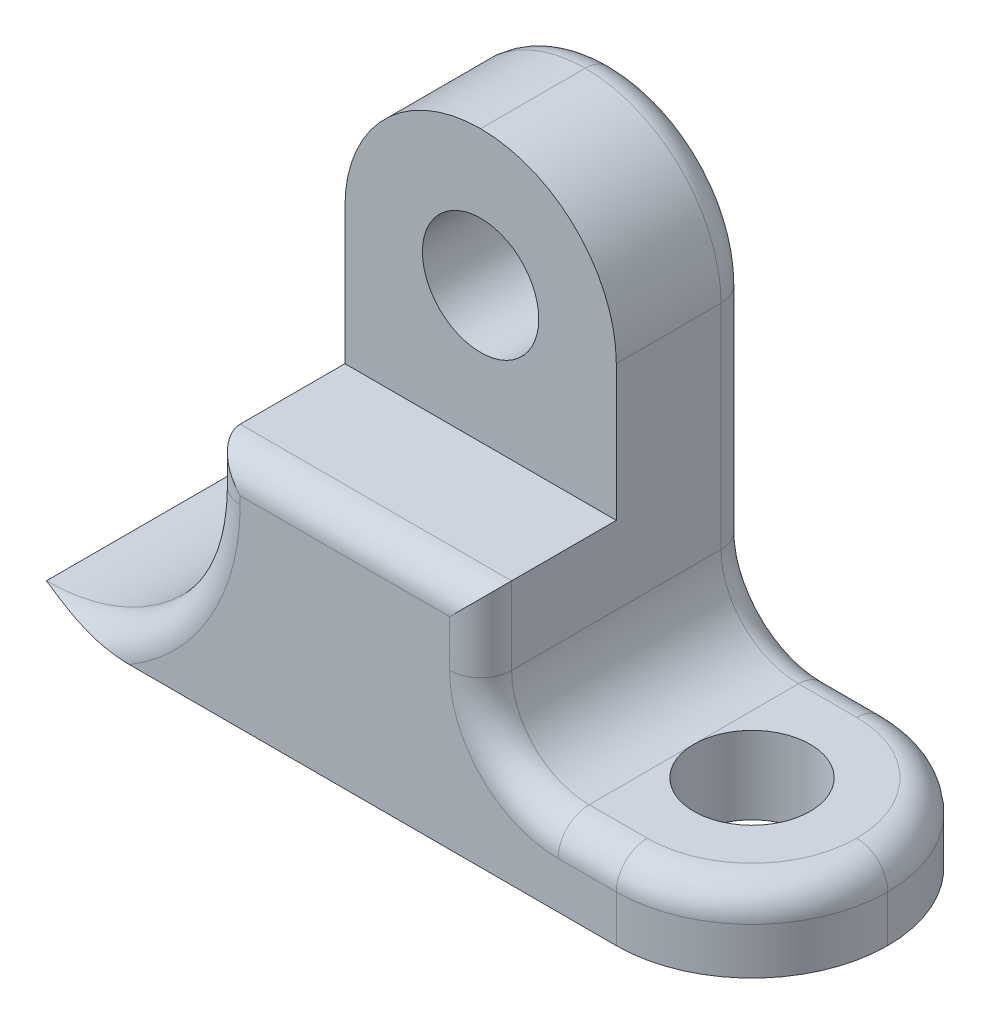
ISO-10303-21;
HEADER;
FILE_DESCRIPTION(('STEP AP214'),'2;1');
FILE_NAME('part.step','',(''),(''),'','','');
FILE_SCHEMA(('AUTOMOTIVE_DESIGN { 1 0 10303 214 1 1 1 1 }'));
ENDSEC;
DATA;
#1=APPLICATION_CONTEXT('core data for automotive mechanical design processes');
#2=APPLICATION_PROTOCOL_DEFINITION('international standard','automotive_design',2000,#1);
#3=PRODUCT_CONTEXT('',#1,'mechanical');
#4=PRODUCT('Part','Part','',(#3));
#5=PRODUCT_RELATED_PRODUCT_CATEGORY('part','',(#4));
#6=PRODUCT_DEFINITION_FORMATION('','',#4);
#7=PRODUCT_DEFINITION_CONTEXT('part definition',#1,'design');
#8=PRODUCT_DEFINITION('design','',#6,#7);
#9=PRODUCT_DEFINITION_SHAPE('','',#8);
#10=(LENGTH_UNIT() NAMED_UNIT(*) SI_UNIT(.MILLI.,.METRE.));
#11=(NAMED_UNIT(*) PLANE_ANGLE_UNIT() SI_UNIT($,.RADIAN.));
#12=(NAMED_UNIT(*) SI_UNIT($,.STERADIAN.) SOLID_ANGLE_UNIT());
#13=UNCERTAINTY_MEASURE_WITH_UNIT(LENGTH_MEASURE(1.E-05),#10,'distance_accuracy_value','');
#14=(GEOMETRIC_REPRESENTATION_CONTEXT(3) GLOBAL_UNCERTAINTY_ASSIGNED_CONTEXT((#13)) GLOBAL_UNIT_ASSIGNED_CONTEXT((#10,
#11,#12)) REPRESENTATION_CONTEXT('',''));
#15=CARTESIAN_POINT('',(0.,0.,0.));
#16=DIRECTION('',(0.,0.,1.));
#17=DIRECTION('',(1.,0.,0.));
#18=AXIS2_PLACEMENT_3D('',#15,#16,#17);
#19=CARTESIAN_POINT('',(-8.5,-1.5,7.));
#20=DIRECTION('',(0.,0.,-1.));
#21=DIRECTION('',(-1.,0.,0.));
#22=AXIS2_PLACEMENT_3D('',#19,#20,#21);
#23=CYLINDRICAL_SURFACE('',#22,5.);
#24=DIRECTION('',(0.,0.,-1.));
#25=VECTOR('',#24,1.);
#26=CARTESIAN_POINT('',(-3.5,-1.5,7.));
#27=LINE('',#26,#25);
#28=CARTESIAN_POINT('',(-3.5,-1.5,6.2));
#29=VERTEX_POINT('',#28);
#30=CARTESIAN_POINT('',(-3.5,-1.5,0.8));
#31=VERTEX_POINT('',#30);
#32=EDGE_CURVE('E218',#29,#31,#27,.T.);
#33=ORIENTED_EDGE('',*,*,#32,.T.);
#34=CARTESIAN_POINT('',(-8.5,-1.5,0.8));
#35=DIRECTION('',(0.,0.,1.));
#36=DIRECTION('',(1.,0.,0.));
#37=AXIS2_PLACEMENT_3D('',#34,#35,#36);
#38=CIRCLE('',#37,5.);
#39=CARTESIAN_POINT('',(-8.5,-6.5,0.8));
#40=VERTEX_POINT('',#39);
#41=EDGE_CURVE('E286',#31,#40,#38,.F.);
#42=ORIENTED_EDGE('',*,*,#41,.T.);
#43=DIRECTION('',(0.,0.,-1.));
#44=VECTOR('',#43,1.);
#45=CARTESIAN_POINT('',(-8.5,-6.5,7.));
#46=LINE('',#45,#44);
#47=CARTESIAN_POINT('',(-8.5,-6.5,6.2));
#48=VERTEX_POINT('',#47);
#49=EDGE_CURVE('E223',#48,#40,#46,.T.);
#50=ORIENTED_EDGE('',*,*,#49,.F.);
#51=CARTESIAN_POINT('',(-8.5,-1.5,6.2));
#52=DIRECTION('',(0.,0.,1.));
#53=DIRECTION('',(1.,0.,0.));
#54=AXIS2_PLACEMENT_3D('',#51,#52,#53);
#55=CIRCLE('',#54,5.);
#56=EDGE_CURVE('E284',#48,#29,#55,.T.);
#57=ORIENTED_EDGE('',*,*,#56,.T.);
#58=EDGE_LOOP('',(#33,#42,#50,#57));
#59=FACE_BOUND('',#58,.T.);
#60=ADVANCED_FACE('F39',(#59),#23,.F.);
#61=CARTESIAN_POINT('',(0.,-6.5,7.));
#62=DIRECTION('',(0.,-1.,0.));
#63=DIRECTION('',(0.,0.,-1.));
#64=AXIS2_PLACEMENT_3D('',#61,#62,#63);
#65=PLANE('',#64);
#66=CARTESIAN_POINT('',(7.,-6.5,3.5));
#67=DIRECTION('',(0.,1.,0.));
#68=DIRECTION('',(-1.,0.,0.));
#69=AXIS2_PLACEMENT_3D('',#66,#67,#68);
#70=CIRCLE('',#69,1.5);
#71=CARTESIAN_POINT('',(5.5,-6.5,3.5));
#72=VERTEX_POINT('',#71);
#73=EDGE_CURVE('E455',#72,#72,#70,.T.);
#74=ORIENTED_EDGE('',*,*,#73,.T.);
#75=EDGE_LOOP('',(#74));
#76=FACE_BOUND('',#75,.T.);
#77=ORIENTED_EDGE('',*,*,#49,.T.);
#78=CARTESIAN_POINT('',(-5.56061230866019,-6.5,0.));
#79=CARTESIAN_POINT('',(-5.61843790454167,-6.5,8.93337683398929E-06));
#80=CARTESIAN_POINT('',(-5.67623988707474,-6.5,0.00160899487362097));
#81=CARTESIAN_POINT('',(-5.79166453259725,-6.5,0.00763971675142861));
#82=CARTESIAN_POINT('',(-5.84928728143457,-6.5,0.0120687021797724));
#83=CARTESIAN_POINT('',(-6.02146755610683,-6.5,0.029043405144011));
#84=CARTESIAN_POINT('',(-6.13566365845437,-6.5,0.0452809031727915));
#85=CARTESIAN_POINT('',(-6.36158412393588,-6.5,0.0852657219761762));
#86=CARTESIAN_POINT('',(-6.47332157283069,-6.5,0.10894233721513));
#87=CARTESIAN_POINT('',(-6.69544269756369,-6.5,0.162238621695083));
#88=CARTESIAN_POINT('',(-6.80582522767447,-6.5,0.191862996291862));
#89=CARTESIAN_POINT('',(-7.04921198528406,-6.5,0.262671761824172));
#90=CARTESIAN_POINT('',(-7.18188879112123,-6.5,0.304967662972999));
#91=CARTESIAN_POINT('',(-7.44562616701472,-6.5,0.394360475600995));
#92=CARTESIAN_POINT('',(-7.576686312957,-6.5,0.441458618084553));
#93=CARTESIAN_POINT('',(-7.9686406836952,-6.5,0.587531009615996));
#94=CARTESIAN_POINT('',(-8.22778903759083,-6.5,0.691116851145545));
#95=CARTESIAN_POINT('',(-8.4912462460567,-6.5,0.796498510921233));
#96=CARTESIAN_POINT('',(-8.4956231272981,-6.5,0.798249263723546));
#97=CARTESIAN_POINT('',(-8.5,-6.5,0.8));
#98=B_SPLINE_CURVE_WITH_KNOTS('',3,(#78,#79,#80,#81,#82,#83,#84,#85,#86,#87,#88,#89,#90,#91,#92,
#93,#94,#95,#96,#97),.UNSPECIFIED.,.F.,.F.,(4,2,2,2,2,2,2,2,2,4),(0.,0.173418666547662,
0.346734750222216,0.692390891158026,1.03485633591092,1.37759378506866,1.79522407896125,
2.21296169845093,3.05007204962128,3.06421418524502),.UNSPECIFIED.);
#99=CARTESIAN_POINT('',(-5.56061230866019,-6.5,0.));
#100=VERTEX_POINT('',#99);
#101=EDGE_CURVE('E295',#40,#100,#98,.F.);
#102=ORIENTED_EDGE('',*,*,#101,.T.);
#103=DIRECTION('',(-1.,0.,0.));
#104=VECTOR('',#103,1.);
#105=CARTESIAN_POINT('',(0.,-6.5,0.));
#106=LINE('',#105,#104);
#107=CARTESIAN_POINT('',(7.,-6.5,0.));
#108=VERTEX_POINT('',#107);
#109=EDGE_CURVE('E211',#108,#100,#106,.T.);
#110=ORIENTED_EDGE('',*,*,#109,.F.);
#111=CARTESIAN_POINT('',(7.,-6.5,3.5));
#112=DIRECTION('',(0.,-1.,0.));
#113=DIRECTION('',(0.,0.,-1.));
#114=AXIS2_PLACEMENT_3D('',#111,#112,#113);
#115=CIRCLE('',#114,3.5);
#116=CARTESIAN_POINT('',(10.5,-6.5,3.5));
#117=VERTEX_POINT('',#116);
#118=EDGE_CURVE('E230',#108,#117,#115,.T.);
#119=ORIENTED_EDGE('',*,*,#118,.T.);
#120=CARTESIAN_POINT('',(7.,-6.5,3.5));
#121=DIRECTION('',(0.,-1.,0.));
#122=DIRECTION('',(0.,0.,-1.));
#123=AXIS2_PLACEMENT_3D('',#120,#121,#122);
#124=CIRCLE('',#123,3.5);
#125=CARTESIAN_POINT('',(7.,-6.5,7.));
#126=VERTEX_POINT('',#125);
#127=EDGE_CURVE('E228',#117,#126,#124,.T.);
#128=ORIENTED_EDGE('',*,*,#127,.T.);
#129=DIRECTION('',(-1.,0.,0.));
#130=VECTOR('',#129,1.);
#131=CARTESIAN_POINT('',(0.,-6.5,7.));
#132=LINE('',#131,#130);
#133=CARTESIAN_POINT('',(-5.56061230866019,-6.5,7.));
#134=VERTEX_POINT('',#133);
#135=EDGE_CURVE('E215',#126,#134,#132,.T.);
#136=ORIENTED_EDGE('',*,*,#135,.T.);
#137=CARTESIAN_POINT('',(-5.56061230866019,-6.5,7.));
#138=CARTESIAN_POINT('',(-5.61843790454167,-6.5,6.99999106662317));
#139=CARTESIAN_POINT('',(-5.67623988707474,-6.5,6.99839100512638));
#140=CARTESIAN_POINT('',(-5.79166453259725,-6.5,6.99236028324857));
#141=CARTESIAN_POINT('',(-5.84928728143457,-6.5,6.98793129782023));
#142=CARTESIAN_POINT('',(-6.02146755610683,-6.5,6.97095659485599));
#143=CARTESIAN_POINT('',(-6.13566365845437,-6.5,6.95471909682721));
#144=CARTESIAN_POINT('',(-6.36158412393588,-6.5,6.91473427802382));
#145=CARTESIAN_POINT('',(-6.47332157283069,-6.5,6.89105766278487));
#146=CARTESIAN_POINT('',(-6.69544269756369,-6.5,6.83776137830492));
#147=CARTESIAN_POINT('',(-6.80582522767447,-6.5,6.80813700370814));
#148=CARTESIAN_POINT('',(-7.04921198528406,-6.5,6.73732823817583));
#149=CARTESIAN_POINT('',(-7.18188879112123,-6.5,6.695032337027));
#150=CARTESIAN_POINT('',(-7.44562616701472,-6.5,6.605639524399));
#151=CARTESIAN_POINT('',(-7.576686312957,-6.5,6.55854138191545));
#152=CARTESIAN_POINT('',(-7.96864068369521,-6.5,6.41246899038401));
#153=CARTESIAN_POINT('',(-8.22778903759084,-6.5,6.30888314885447));
#154=CARTESIAN_POINT('',(-8.4912462460567,-6.5,6.20350148907877));
#155=CARTESIAN_POINT('',(-8.4956231272981,-6.5,6.20175073627645));
#156=CARTESIAN_POINT('',(-8.5,-6.5,6.2));
#157=B_SPLINE_CURVE_WITH_KNOTS('',3,(#137,#138,#139,#140,#141,#142,#143,#144,#145,#146,#147,
#148,#149,#150,#151,#152,#153,#154,#155,#156),.UNSPECIFIED.,.F.,.F.,(4,2,2,2,2,2,2,2,2,4),(0.,
0.173418666547661,0.346734750222216,0.692390891158025,1.03485633591092,1.37759378506866,
1.79522407896125,2.21296169845093,3.05007204962128,3.06421418524502),.UNSPECIFIED.);
#158=EDGE_CURVE('E288',#134,#48,#157,.T.);
#159=ORIENTED_EDGE('',*,*,#158,.T.);
#160=EDGE_LOOP('',(#77,#102,#110,#119,#128,#136,#159));
#161=FACE_BOUND('',#160,.T.);
#162=ADVANCED_FACE('F300',(#76,#161),#65,.T.);
#163=CARTESIAN_POINT('',(0.,-4.5,7.));
#164=DIRECTION('',(0.,-1.,0.));
#165=DIRECTION('',(1.,0.,0.));
#166=AXIS2_PLACEMENT_3D('',#163,#164,#165);
#167=PLANE('',#166);
#168=DIRECTION('',(0.,0.,-1.));
#169=VECTOR('',#168,1.);
#170=CARTESIAN_POINT('',(5.5,-4.5,7.));
#171=LINE('',#170,#169);
#172=CARTESIAN_POINT('',(5.5,-4.5,3.5));
#173=VERTEX_POINT('',#172);
#174=CARTESIAN_POINT('',(5.5,-4.5,6.2));
#175=VERTEX_POINT('',#174);
#176=EDGE_CURVE('E250',#173,#175,#171,.F.);
#177=ORIENTED_EDGE('',*,*,#176,.T.);
#178=DIRECTION('',(-1.,0.,0.));
#179=VECTOR('',#178,1.);
#180=CARTESIAN_POINT('',(7.,-4.5,6.2));
#181=LINE('',#180,#179);
#182=CARTESIAN_POINT('',(7.,-4.5,6.2));
#183=VERTEX_POINT('',#182);
#184=EDGE_CURVE('E64',#175,#183,#181,.F.);
#185=ORIENTED_EDGE('',*,*,#184,.T.);
#186=CARTESIAN_POINT('',(7.,-4.5,3.5));
#187=DIRECTION('',(0.,-1.,0.));
#188=DIRECTION('',(1.,0.,0.));
#189=AXIS2_PLACEMENT_3D('',#186,#187,#188);
#190=CIRCLE('',#189,2.7);
#191=CARTESIAN_POINT('',(9.7,-4.5,3.5));
#192=VERTEX_POINT('',#191);
#193=EDGE_CURVE('E495',#183,#192,#190,.F.);
#194=ORIENTED_EDGE('',*,*,#193,.T.);
#195=CARTESIAN_POINT('',(7.,-4.5,3.5));
#196=DIRECTION('',(0.,-1.,0.));
#197=DIRECTION('',(1.,0.,0.));
#198=AXIS2_PLACEMENT_3D('',#195,#196,#197);
#199=CIRCLE('',#198,2.7);
#200=CARTESIAN_POINT('',(7.,-4.5,0.8));
#201=VERTEX_POINT('',#200);
#202=EDGE_CURVE('E498',#192,#201,#199,.F.);
#203=ORIENTED_EDGE('',*,*,#202,.T.);
#204=DIRECTION('',(-1.,0.,0.));
#205=VECTOR('',#204,1.);
#206=CARTESIAN_POINT('',(0.,-4.5,0.8));
#207=LINE('',#206,#205);
#208=CARTESIAN_POINT('',(5.5,-4.5,0.8));
#209=VERTEX_POINT('',#208);
#210=EDGE_CURVE('E412',#201,#209,#207,.T.);
#211=ORIENTED_EDGE('',*,*,#210,.T.);
#212=DIRECTION('',(0.,0.,-1.));
#213=VECTOR('',#212,1.);
#214=CARTESIAN_POINT('',(5.5,-4.5,7.));
#215=LINE('',#214,#213);
#216=EDGE_CURVE('E252',#209,#173,#215,.F.);
#217=ORIENTED_EDGE('',*,*,#216,.T.);
#218=CARTESIAN_POINT('',(7.,-4.5,3.5));
#219=DIRECTION('',(0.,1.,0.));
#220=DIRECTION('',(-1.,0.,0.));
#221=AXIS2_PLACEMENT_3D('',#218,#219,#220);
#222=CIRCLE('',#221,1.5);
#223=EDGE_CURVE('E450',#173,#173,#222,.T.);
#224=ORIENTED_EDGE('',*,*,#223,.F.);
#225=EDGE_LOOP('',(#177,#185,#194,#203,#211,#217,#224));
#226=FACE_BOUND('',#225,.T.);
#227=ADVANCED_FACE('F369',(#226),#167,.F.);
#228=CARTESIAN_POINT('',(3.5,0.,7.));
#229=DIRECTION('',(1.,0.,0.));
#230=DIRECTION('',(0.,1.,0.));
#231=AXIS2_PLACEMENT_3D('',#228,#229,#230);
#232=PLANE('',#231);
#233=DIRECTION('',(0.,0.,-1.));
#234=VECTOR('',#233,1.);
#235=CARTESIAN_POINT('',(3.5,-2.5,7.));
#236=LINE('',#235,#234);
#237=CARTESIAN_POINT('',(3.5,-2.5,6.2));
#238=VERTEX_POINT('',#237);
#239=CARTESIAN_POINT('',(3.5,-2.5,0.8));
#240=VERTEX_POINT('',#239);
#241=EDGE_CURVE('E243',#238,#240,#236,.T.);
#242=ORIENTED_EDGE('',*,*,#241,.T.);
#243=DIRECTION('',(0.,-1.,0.));
#244=VECTOR('',#243,1.);
#245=CARTESIAN_POINT('',(3.5,3.,0.8));
#246=LINE('',#245,#244);
#247=CARTESIAN_POINT('',(3.5,3.,0.8));
#248=VERTEX_POINT('',#247);
#249=EDGE_CURVE('E538',#240,#248,#246,.F.);
#250=ORIENTED_EDGE('',*,*,#249,.T.);
#251=DIRECTION('',(0.,0.,-1.));
#252=VECTOR('',#251,1.);
#253=CARTESIAN_POINT('',(3.5,3.,7.));
#254=LINE('',#253,#252);
#255=CARTESIAN_POINT('',(3.5,3.,3.5));
#256=VERTEX_POINT('',#255);
#257=EDGE_CURVE('E236',#248,#256,#254,.F.);
#258=ORIENTED_EDGE('',*,*,#257,.T.);
#259=DIRECTION('',(0.,1.,0.));
#260=VECTOR('',#259,1.);
#261=CARTESIAN_POINT('',(3.5,6.5,3.5));
#262=LINE('',#261,#260);
#263=CARTESIAN_POINT('',(3.5,-0.5,3.5));
#264=VERTEX_POINT('',#263);
#265=EDGE_CURVE('E204',#264,#256,#262,.T.);
#266=ORIENTED_EDGE('',*,*,#265,.F.);
#267=DIRECTION('',(0.,0.,1.));
#268=VECTOR('',#267,1.);
#269=CARTESIAN_POINT('',(3.5,-0.5,3.5));
#270=LINE('',#269,#268);
#271=CARTESIAN_POINT('',(3.5,-0.5,6.2));
#272=VERTEX_POINT('',#271);
#273=EDGE_CURVE('E203',#264,#272,#270,.T.);
#274=ORIENTED_EDGE('',*,*,#273,.T.);
#275=DIRECTION('',(0.,-1.,0.));
#276=VECTOR('',#275,1.);
#277=CARTESIAN_POINT('',(3.5,0.,6.2));
#278=LINE('',#277,#276);
#279=EDGE_CURVE('E416',#272,#238,#278,.T.);
#280=ORIENTED_EDGE('',*,*,#279,.T.);
#281=EDGE_LOOP('',(#242,#250,#258,#266,#274,#280));
#282=FACE_BOUND('',#281,.T.);
#283=ADVANCED_FACE('F487',(#282),#232,.T.);
#284=CARTESIAN_POINT('',(-3.5,0.,7.));
#285=DIRECTION('',(1.,0.,0.));
#286=DIRECTION('',(0.,1.,0.));
#287=AXIS2_PLACEMENT_3D('',#284,#285,#286);
#288=PLANE('',#287);
#289=ORIENTED_EDGE('',*,*,#32,.F.);
#290=DIRECTION('',(0.,-1.,0.));
#291=VECTOR('',#290,1.);
#292=CARTESIAN_POINT('',(-3.5,-0.5,6.2));
#293=LINE('',#292,#291);
#294=CARTESIAN_POINT('',(-3.5,-0.5,6.2));
#295=VERTEX_POINT('',#294);
#296=EDGE_CURVE('E209',#29,#295,#293,.F.);
#297=ORIENTED_EDGE('',*,*,#296,.T.);
#298=DIRECTION('',(0.,0.,1.));
#299=VECTOR('',#298,1.);
#300=CARTESIAN_POINT('',(-3.5,-0.5,3.5));
#301=LINE('',#300,#299);
#302=CARTESIAN_POINT('',(-3.5,-0.5,3.5));
#303=VERTEX_POINT('',#302);
#304=EDGE_CURVE('E200',#303,#295,#301,.T.);
#305=ORIENTED_EDGE('',*,*,#304,.F.);
#306=DIRECTION('',(0.,-1.,0.));
#307=VECTOR('',#306,1.);
#308=CARTESIAN_POINT('',(-3.5,-0.5,3.5));
#309=LINE('',#308,#307);
#310=CARTESIAN_POINT('',(-3.5,3.,3.5));
#311=VERTEX_POINT('',#310);
#312=EDGE_CURVE('E182',#311,#303,#309,.T.);
#313=ORIENTED_EDGE('',*,*,#312,.F.);
#314=DIRECTION('',(0.,0.,-1.));
#315=VECTOR('',#314,1.);
#316=CARTESIAN_POINT('',(-3.5,3.,0.));
#317=LINE('',#316,#315);
#318=CARTESIAN_POINT('',(-3.5,3.,0.8));
#319=VERTEX_POINT('',#318);
#320=EDGE_CURVE('E241',#311,#319,#317,.T.);
#321=ORIENTED_EDGE('',*,*,#320,.T.);
#322=DIRECTION('',(0.,-1.,0.));
#323=VECTOR('',#322,1.);
#324=CARTESIAN_POINT('',(-3.5,0.,0.8));
#325=LINE('',#324,#323);
#326=EDGE_CURVE('E267',#319,#31,#325,.T.);
#327=ORIENTED_EDGE('',*,*,#326,.T.);
#328=EDGE_LOOP('',(#289,#297,#305,#313,#321,#327));
#329=FACE_BOUND('',#328,.T.);
#330=ADVANCED_FACE('F207',(#329),#288,.F.);
#331=CARTESIAN_POINT('',(0.,0.,7.));
#332=DIRECTION('',(0.,0.,1.));
#333=DIRECTION('',(1.,0.,0.));
#334=AXIS2_PLACEMENT_3D('',#331,#332,#333);
#335=PLANE('',#334);
#336=DIRECTION('',(0.,1.,0.));
#337=VECTOR('',#336,1.);
#338=CARTESIAN_POINT('',(7.,-4.5,7.));
#339=LINE('',#338,#337);
#340=CARTESIAN_POINT('',(7.,-5.3,7.));
#341=VERTEX_POINT('',#340);
#342=EDGE_CURVE('E233',#126,#341,#339,.T.);
#343=ORIENTED_EDGE('',*,*,#342,.T.);
#344=DIRECTION('',(-1.,0.,0.));
#345=VECTOR('',#344,1.);
#346=CARTESIAN_POINT('',(5.5,-5.3,7.));
#347=LINE('',#346,#345);
#348=CARTESIAN_POINT('',(5.5,-5.3,7.));
#349=VERTEX_POINT('',#348);
#350=EDGE_CURVE('E265',#341,#349,#347,.T.);
#351=ORIENTED_EDGE('',*,*,#350,.T.);
#352=CARTESIAN_POINT('',(5.5,-2.5,7.));
#353=DIRECTION('',(0.,0.,1.));
#354=DIRECTION('',(1.,0.,0.));
#355=AXIS2_PLACEMENT_3D('',#352,#353,#354);
#356=CIRCLE('',#355,2.8);
#357=CARTESIAN_POINT('',(2.7,-2.5,7.));
#358=VERTEX_POINT('',#357);
#359=EDGE_CURVE('E263',#349,#358,#356,.F.);
#360=ORIENTED_EDGE('',*,*,#359,.T.);
#361=DIRECTION('',(0.,-1.,0.));
#362=VECTOR('',#361,1.);
#363=CARTESIAN_POINT('',(2.7,0.,7.));
#364=LINE('',#363,#362);
#365=CARTESIAN_POINT('',(2.7,-1.3,7.));
#366=VERTEX_POINT('',#365);
#367=EDGE_CURVE('E261',#358,#366,#364,.F.);
#368=ORIENTED_EDGE('',*,*,#367,.T.);
#369=DIRECTION('',(1.,0.,0.));
#370=VECTOR('',#369,1.);
#371=CARTESIAN_POINT('',(-3.5,-1.3,7.));
#372=LINE('',#371,#370);
#373=CARTESIAN_POINT('',(-2.7,-1.3,7.));
#374=VERTEX_POINT('',#373);
#375=EDGE_CURVE('E259',#366,#374,#372,.F.);
#376=ORIENTED_EDGE('',*,*,#375,.T.);
#377=DIRECTION('',(0.,-1.,0.));
#378=VECTOR('',#377,1.);
#379=CARTESIAN_POINT('',(-2.7,-1.5,7.));
#380=LINE('',#379,#378);
#381=CARTESIAN_POINT('',(-2.7,-1.5,7.));
#382=VERTEX_POINT('',#381);
#383=EDGE_CURVE('E256',#374,#382,#380,.T.);
#384=ORIENTED_EDGE('',*,*,#383,.T.);
#385=CARTESIAN_POINT('',(-8.5,-1.5,7.));
#386=DIRECTION('',(0.,0.,1.));
#387=DIRECTION('',(1.,0.,0.));
#388=AXIS2_PLACEMENT_3D('',#385,#386,#387);
#389=CIRCLE('',#388,5.8);
#390=EDGE_CURVE('E254',#382,#134,#389,.F.);
#391=ORIENTED_EDGE('',*,*,#390,.T.);
#392=ORIENTED_EDGE('',*,*,#135,.F.);
#393=EDGE_LOOP('',(#343,#351,#360,#368,#376,#384,#391,#392));
#394=FACE_BOUND('',#393,.T.);
#395=ADVANCED_FACE('F478',(#394),#335,.T.);
#396=CARTESIAN_POINT('',(0.,0.,0.));
#397=DIRECTION('',(0.,0.,1.));
#398=DIRECTION('',(1.,0.,0.));
#399=AXIS2_PLACEMENT_3D('',#396,#397,#398);
#400=PLANE('',#399);
#401=ORIENTED_EDGE('',*,*,#109,.T.);
#402=CARTESIAN_POINT('',(-8.5,-1.5,0.));
#403=DIRECTION('',(0.,0.,1.));
#404=DIRECTION('',(1.,0.,0.));
#405=AXIS2_PLACEMENT_3D('',#402,#403,#404);
#406=CIRCLE('',#405,5.8);
#407=CARTESIAN_POINT('',(-2.7,-1.5,0.));
#408=VERTEX_POINT('',#407);
#409=EDGE_CURVE('E282',#100,#408,#406,.T.);
#410=ORIENTED_EDGE('',*,*,#409,.T.);
#411=DIRECTION('',(0.,-1.,0.));
#412=VECTOR('',#411,1.);
#413=CARTESIAN_POINT('',(-2.7,0.,0.));
#414=LINE('',#413,#412);
#415=CARTESIAN_POINT('',(-2.7,3.,0.));
#416=VERTEX_POINT('',#415);
#417=EDGE_CURVE('E280',#408,#416,#414,.F.);
#418=ORIENTED_EDGE('',*,*,#417,.T.);
#419=CARTESIAN_POINT('',(0.,3.,0.));
#420=DIRECTION('',(0.,0.,1.));
#421=DIRECTION('',(1.,0.,0.));
#422=AXIS2_PLACEMENT_3D('',#419,#420,#421);
#423=CIRCLE('',#422,2.7);
#424=CARTESIAN_POINT('',(0.,5.7,0.));
#425=VERTEX_POINT('',#424);
#426=EDGE_CURVE('E278',#416,#425,#423,.F.);
#427=ORIENTED_EDGE('',*,*,#426,.T.);
#428=CARTESIAN_POINT('',(0.,3.,0.));
#429=DIRECTION('',(0.,0.,1.));
#430=DIRECTION('',(1.,0.,0.));
#431=AXIS2_PLACEMENT_3D('',#428,#429,#430);
#432=CIRCLE('',#431,2.7);
#433=CARTESIAN_POINT('',(2.7,3.,0.));
#434=VERTEX_POINT('',#433);
#435=EDGE_CURVE('E276',#425,#434,#432,.F.);
#436=ORIENTED_EDGE('',*,*,#435,.T.);
#437=DIRECTION('',(0.,-1.,0.));
#438=VECTOR('',#437,1.);
#439=CARTESIAN_POINT('',(2.7,-2.5,0.));
#440=LINE('',#439,#438);
#441=CARTESIAN_POINT('',(2.7,-2.5,0.));
#442=VERTEX_POINT('',#441);
#443=EDGE_CURVE('E274',#434,#442,#440,.T.);
#444=ORIENTED_EDGE('',*,*,#443,.T.);
#445=CARTESIAN_POINT('',(5.5,-2.5,0.));
#446=DIRECTION('',(0.,0.,1.));
#447=DIRECTION('',(1.,0.,0.));
#448=AXIS2_PLACEMENT_3D('',#445,#446,#447);
#449=CIRCLE('',#448,2.8);
#450=CARTESIAN_POINT('',(5.5,-5.3,0.));
#451=VERTEX_POINT('',#450);
#452=EDGE_CURVE('E270',#442,#451,#449,.T.);
#453=ORIENTED_EDGE('',*,*,#452,.T.);
#454=DIRECTION('',(-1.,0.,0.));
#455=VECTOR('',#454,1.);
#456=CARTESIAN_POINT('',(0.,-5.3,0.));
#457=LINE('',#456,#455);
#458=CARTESIAN_POINT('',(7.,-5.3,0.));
#459=VERTEX_POINT('',#458);
#460=EDGE_CURVE('E272',#451,#459,#457,.F.);
#461=ORIENTED_EDGE('',*,*,#460,.T.);
#462=DIRECTION('',(0.,1.,0.));
#463=VECTOR('',#462,1.);
#464=CARTESIAN_POINT('',(7.,0.,0.));
#465=LINE('',#464,#463);
#466=EDGE_CURVE('E226',#459,#108,#465,.F.);
#467=ORIENTED_EDGE('',*,*,#466,.T.);
#468=EDGE_LOOP('',(#401,#410,#418,#427,#436,#444,#453,#461,#467));
#469=FACE_BOUND('',#468,.T.);
#470=CARTESIAN_POINT('',(0.,3.,0.));
#471=DIRECTION('',(0.,0.,1.));
#472=DIRECTION('',(1.,0.,0.));
#473=AXIS2_PLACEMENT_3D('',#470,#471,#472);
#474=CIRCLE('',#473,1.5);
#475=CARTESIAN_POINT('',(1.5,3.,0.));
#476=VERTEX_POINT('',#475);
#477=EDGE_CURVE('E247',#476,#476,#474,.T.);
#478=ORIENTED_EDGE('',*,*,#477,.T.);
#479=EDGE_LOOP('',(#478));
#480=FACE_BOUND('',#479,.T.);
#481=ADVANCED_FACE('F474',(#469,#480),#400,.F.);
#482=CARTESIAN_POINT('',(3.5,-0.5,3.5));
#483=DIRECTION('',(0.,-1.,0.));
#484=DIRECTION('',(0.,0.,-1.));
#485=AXIS2_PLACEMENT_3D('',#482,#483,#484);
#486=PLANE('',#485);
#487=ORIENTED_EDGE('',*,*,#304,.T.);
#488=DIRECTION('',(1.,0.,0.));
#489=VECTOR('',#488,1.);
#490=CARTESIAN_POINT('',(3.5,-0.5,6.2));
#491=LINE('',#490,#489);
#492=EDGE_CURVE('E11',#295,#272,#491,.T.);
#493=ORIENTED_EDGE('',*,*,#492,.T.);
#494=ORIENTED_EDGE('',*,*,#273,.F.);
#495=DIRECTION('',(1.,0.,0.));
#496=VECTOR('',#495,1.);
#497=CARTESIAN_POINT('',(3.5,-0.5,3.5));
#498=LINE('',#497,#496);
#499=EDGE_CURVE('E186',#303,#264,#498,.T.);
#500=ORIENTED_EDGE('',*,*,#499,.F.);
#501=EDGE_LOOP('',(#487,#493,#494,#500));
#502=FACE_BOUND('',#501,.T.);
#503=ADVANCED_FACE('F199',(#502),#486,.F.);
#504=CARTESIAN_POINT('',(0.,0.,3.5));
#505=DIRECTION('',(0.,0.,-1.));
#506=DIRECTION('',(-1.,0.,0.));
#507=AXIS2_PLACEMENT_3D('',#504,#505,#506);
#508=PLANE('',#507);
#509=CARTESIAN_POINT('',(0.,3.,3.5));
#510=DIRECTION('',(0.,0.,1.));
#511=DIRECTION('',(1.,0.,0.));
#512=AXIS2_PLACEMENT_3D('',#509,#510,#511);
#513=CIRCLE('',#512,1.5);
#514=CARTESIAN_POINT('',(1.5,3.,3.5));
#515=VERTEX_POINT('',#514);
#516=EDGE_CURVE('E460',#515,#515,#513,.T.);
#517=ORIENTED_EDGE('',*,*,#516,.F.);
#518=EDGE_LOOP('',(#517));
#519=FACE_BOUND('',#518,.T.);
#520=ORIENTED_EDGE('',*,*,#265,.T.);
#521=CARTESIAN_POINT('',(0.,3.,3.5));
#522=DIRECTION('',(0.,0.,-1.));
#523=DIRECTION('',(-1.,0.,0.));
#524=AXIS2_PLACEMENT_3D('',#521,#522,#523);
#525=CIRCLE('',#524,3.5);
#526=CARTESIAN_POINT('',(0.,6.5,3.5));
#527=VERTEX_POINT('',#526);
#528=EDGE_CURVE('E239',#256,#527,#525,.F.);
#529=ORIENTED_EDGE('',*,*,#528,.T.);
#530=CARTESIAN_POINT('',(0.,3.,3.5));
#531=DIRECTION('',(0.,0.,-1.));
#532=DIRECTION('',(-1.,0.,0.));
#533=AXIS2_PLACEMENT_3D('',#530,#531,#532);
#534=CIRCLE('',#533,3.5);
#535=EDGE_CURVE('E190',#527,#311,#534,.F.);
#536=ORIENTED_EDGE('',*,*,#535,.T.);
#537=ORIENTED_EDGE('',*,*,#312,.T.);
#538=ORIENTED_EDGE('',*,*,#499,.T.);
#539=EDGE_LOOP('',(#520,#529,#536,#537,#538));
#540=FACE_BOUND('',#539,.T.);
#541=ADVANCED_FACE('F185',(#519,#540),#508,.F.);
#542=CARTESIAN_POINT('',(7.,0.,3.5));
#543=DIRECTION('',(0.,-1.,0.));
#544=DIRECTION('',(0.,0.,-1.));
#545=AXIS2_PLACEMENT_3D('',#542,#543,#544);
#546=CYLINDRICAL_SURFACE('',#545,3.5);
#547=DIRECTION('',(0.,1.,0.));
#548=VECTOR('',#547,1.);
#549=CARTESIAN_POINT('',(10.5,-6.5,3.5));
#550=LINE('',#549,#548);
#551=CARTESIAN_POINT('',(10.5,-5.3,3.5));
#552=VERTEX_POINT('',#551);
#553=EDGE_CURVE('E195',#552,#117,#550,.F.);
#554=ORIENTED_EDGE('',*,*,#553,.F.);
#555=CARTESIAN_POINT('',(7.,-5.3,3.5));
#556=DIRECTION('',(0.,-1.,0.));
#557=DIRECTION('',(1.,0.,0.));
#558=AXIS2_PLACEMENT_3D('',#555,#556,#557);
#559=CIRCLE('',#558,3.5);
#560=EDGE_CURVE('E494',#552,#341,#559,.T.);
#561=ORIENTED_EDGE('',*,*,#560,.T.);
#562=ORIENTED_EDGE('',*,*,#342,.F.);
#563=ORIENTED_EDGE('',*,*,#127,.F.);
#564=EDGE_LOOP('',(#554,#561,#562,#563));
#565=FACE_BOUND('',#564,.T.);
#566=ADVANCED_FACE('F376',(#565),#546,.T.);
#567=CARTESIAN_POINT('',(7.,0.,3.5));
#568=DIRECTION('',(0.,1.,0.));
#569=DIRECTION('',(0.,0.,1.));
#570=AXIS2_PLACEMENT_3D('',#567,#568,#569);
#571=CYLINDRICAL_SURFACE('',#570,3.5);
#572=ORIENTED_EDGE('',*,*,#466,.F.);
#573=CARTESIAN_POINT('',(7.,-5.3,3.5));
#574=DIRECTION('',(0.,-1.,0.));
#575=DIRECTION('',(1.,0.,0.));
#576=AXIS2_PLACEMENT_3D('',#573,#574,#575);
#577=CIRCLE('',#576,3.5);
#578=EDGE_CURVE('E49',#459,#552,#577,.T.);
#579=ORIENTED_EDGE('',*,*,#578,.T.);
#580=ORIENTED_EDGE('',*,*,#553,.T.);
#581=ORIENTED_EDGE('',*,*,#118,.F.);
#582=EDGE_LOOP('',(#572,#579,#580,#581));
#583=FACE_BOUND('',#582,.T.);
#584=ADVANCED_FACE('F372',(#583),#571,.T.);
#585=CARTESIAN_POINT('',(0.,3.,7.));
#586=DIRECTION('',(0.,0.,1.));
#587=DIRECTION('',(1.,0.,0.));
#588=AXIS2_PLACEMENT_3D('',#585,#586,#587);
#589=CYLINDRICAL_SURFACE('',#588,3.5);
#590=DIRECTION('',(0.,0.,-1.));
#591=VECTOR('',#590,1.);
#592=CARTESIAN_POINT('',(0.,6.5,3.5));
#593=LINE('',#592,#591);
#594=CARTESIAN_POINT('',(0.,6.5,0.8));
#595=VERTEX_POINT('',#594);
#596=EDGE_CURVE('E245',#595,#527,#593,.F.);
#597=ORIENTED_EDGE('',*,*,#596,.F.);
#598=CARTESIAN_POINT('',(0.,3.,0.8));
#599=DIRECTION('',(0.,0.,1.));
#600=DIRECTION('',(1.,0.,0.));
#601=AXIS2_PLACEMENT_3D('',#598,#599,#600);
#602=CIRCLE('',#601,3.5);
#603=EDGE_CURVE('E513',#595,#319,#602,.T.);
#604=ORIENTED_EDGE('',*,*,#603,.T.);
#605=ORIENTED_EDGE('',*,*,#320,.F.);
#606=ORIENTED_EDGE('',*,*,#535,.F.);
#607=EDGE_LOOP('',(#597,#604,#605,#606));
#608=FACE_BOUND('',#607,.T.);
#609=ADVANCED_FACE('F375',(#608),#589,.T.);
#610=CARTESIAN_POINT('',(0.,3.,7.));
#611=DIRECTION('',(0.,0.,-1.));
#612=DIRECTION('',(-1.,0.,0.));
#613=AXIS2_PLACEMENT_3D('',#610,#611,#612);
#614=CYLINDRICAL_SURFACE('',#613,3.5);
#615=ORIENTED_EDGE('',*,*,#257,.F.);
#616=CARTESIAN_POINT('',(0.,3.,0.8));
#617=DIRECTION('',(0.,0.,1.));
#618=DIRECTION('',(1.,0.,0.));
#619=AXIS2_PLACEMENT_3D('',#616,#617,#618);
#620=CIRCLE('',#619,3.5);
#621=EDGE_CURVE('E541',#248,#595,#620,.T.);
#622=ORIENTED_EDGE('',*,*,#621,.T.);
#623=ORIENTED_EDGE('',*,*,#596,.T.);
#624=ORIENTED_EDGE('',*,*,#528,.F.);
#625=EDGE_LOOP('',(#615,#622,#623,#624));
#626=FACE_BOUND('',#625,.T.);
#627=ADVANCED_FACE('F380',(#626),#614,.T.);
#628=CARTESIAN_POINT('',(0.,3.,0.));
#629=DIRECTION('',(0.,0.,1.));
#630=DIRECTION('',(1.,0.,0.));
#631=AXIS2_PLACEMENT_3D('',#628,#629,#630);
#632=CYLINDRICAL_SURFACE('',#631,1.5);
#633=ORIENTED_EDGE('',*,*,#477,.F.);
#634=EDGE_LOOP('',(#633));
#635=FACE_BOUND('',#634,.T.);
#636=ORIENTED_EDGE('',*,*,#516,.T.);
#637=EDGE_LOOP('',(#636));
#638=FACE_BOUND('',#637,.T.);
#639=ADVANCED_FACE('F383',(#635,#638),#632,.F.);
#640=CARTESIAN_POINT('',(7.,-6.5,3.5));
#641=DIRECTION('',(0.,1.,0.));
#642=DIRECTION('',(-1.,0.,0.));
#643=AXIS2_PLACEMENT_3D('',#640,#641,#642);
#644=CYLINDRICAL_SURFACE('',#643,1.5);
#645=ORIENTED_EDGE('',*,*,#73,.F.);
#646=EDGE_LOOP('',(#645));
#647=FACE_BOUND('',#646,.T.);
#648=ORIENTED_EDGE('',*,*,#223,.T.);
#649=EDGE_LOOP('',(#648));
#650=FACE_BOUND('',#649,.T.);
#651=ADVANCED_FACE('F388',(#647,#650),#644,.F.);
#652=CARTESIAN_POINT('',(5.5,-2.5,7.));
#653=DIRECTION('',(0.,0.,-1.));
#654=DIRECTION('',(-1.,0.,0.));
#655=AXIS2_PLACEMENT_3D('',#652,#653,#654);
#656=CYLINDRICAL_SURFACE('',#655,2.);
#657=ORIENTED_EDGE('',*,*,#241,.F.);
#658=CARTESIAN_POINT('',(5.5,-2.5,6.2));
#659=DIRECTION('',(0.,0.,1.));
#660=DIRECTION('',(1.,0.,0.));
#661=AXIS2_PLACEMENT_3D('',#658,#659,#660);
#662=CIRCLE('',#661,2.);
#663=EDGE_CURVE('E398',#238,#175,#662,.T.);
#664=ORIENTED_EDGE('',*,*,#663,.T.);
#665=ORIENTED_EDGE('',*,*,#176,.F.);
#666=ORIENTED_EDGE('',*,*,#216,.F.);
#667=CARTESIAN_POINT('',(5.5,-2.5,0.8));
#668=DIRECTION('',(0.,0.,1.));
#669=DIRECTION('',(1.,0.,0.));
#670=AXIS2_PLACEMENT_3D('',#667,#668,#669);
#671=CIRCLE('',#670,2.);
#672=EDGE_CURVE('E401',#209,#240,#671,.F.);
#673=ORIENTED_EDGE('',*,*,#672,.T.);
#674=EDGE_LOOP('',(#657,#664,#665,#666,#673));
#675=FACE_BOUND('',#674,.T.);
#676=ADVANCED_FACE('F361',(#675),#656,.F.);
#677=CARTESIAN_POINT('',(-8.5,-1.5,0.8));
#678=DIRECTION('',(0.,0.,1.));
#679=DIRECTION('',(1.,0.,0.));
#680=AXIS2_PLACEMENT_3D('',#677,#678,#679);
#681=TOROIDAL_SURFACE('',#680,5.8,0.8);
#682=ORIENTED_EDGE('',*,*,#101,.F.);
#683=ORIENTED_EDGE('',*,*,#41,.F.);
#684=CARTESIAN_POINT('',(-2.7,-1.5,0.8));
#685=DIRECTION('',(0.,1.,0.));
#686=DIRECTION('',(0.,0.,1.));
#687=AXIS2_PLACEMENT_3D('',#684,#685,#686);
#688=CIRCLE('',#687,0.8);
#689=EDGE_CURVE('E44',#408,#31,#688,.T.);
#690=ORIENTED_EDGE('',*,*,#689,.F.);
#691=ORIENTED_EDGE('',*,*,#409,.F.);
#692=EDGE_LOOP('',(#682,#683,#690,#691));
#693=FACE_BOUND('',#692,.T.);
#694=ADVANCED_FACE('F41',(#693),#681,.T.);
#695=CARTESIAN_POINT('',(-2.7,0.,0.8));
#696=DIRECTION('',(0.,-1.,0.));
#697=DIRECTION('',(1.,0.,0.));
#698=AXIS2_PLACEMENT_3D('',#695,#696,#697);
#699=CYLINDRICAL_SURFACE('',#698,0.8);
#700=ORIENTED_EDGE('',*,*,#689,.T.);
#701=ORIENTED_EDGE('',*,*,#326,.F.);
#702=CARTESIAN_POINT('',(-2.7,3.,0.8));
#703=DIRECTION('',(0.,1.,0.));
#704=DIRECTION('',(0.,0.,1.));
#705=AXIS2_PLACEMENT_3D('',#702,#703,#704);
#706=CIRCLE('',#705,0.8);
#707=EDGE_CURVE('E445',#416,#319,#706,.T.);
#708=ORIENTED_EDGE('',*,*,#707,.F.);
#709=ORIENTED_EDGE('',*,*,#417,.F.);
#710=EDGE_LOOP('',(#700,#701,#708,#709));
#711=FACE_BOUND('',#710,.T.);
#712=ADVANCED_FACE('F354',(#711),#699,.T.);
#713=CARTESIAN_POINT('',(0.,3.,0.8));
#714=DIRECTION('',(0.,0.,1.));
#715=DIRECTION('',(1.,0.,0.));
#716=AXIS2_PLACEMENT_3D('',#713,#714,#715);
#717=TOROIDAL_SURFACE('',#716,2.7,0.8);
#718=ORIENTED_EDGE('',*,*,#707,.T.);
#719=ORIENTED_EDGE('',*,*,#603,.F.);
#720=CARTESIAN_POINT('',(0.,5.7,0.8));
#721=DIRECTION('',(1.,0.,0.));
#722=DIRECTION('',(0.,0.,-1.));
#723=AXIS2_PLACEMENT_3D('',#720,#721,#722);
#724=CIRCLE('',#723,0.8);
#725=EDGE_CURVE('E443',#425,#595,#724,.T.);
#726=ORIENTED_EDGE('',*,*,#725,.F.);
#727=ORIENTED_EDGE('',*,*,#426,.F.);
#728=EDGE_LOOP('',(#718,#719,#726,#727));
#729=FACE_BOUND('',#728,.T.);
#730=ADVANCED_FACE('F351',(#729),#717,.T.);
#731=CARTESIAN_POINT('',(0.,3.,0.8));
#732=DIRECTION('',(0.,0.,1.));
#733=DIRECTION('',(1.,0.,0.));
#734=AXIS2_PLACEMENT_3D('',#731,#732,#733);
#735=TOROIDAL_SURFACE('',#734,2.7,0.8);
#736=ORIENTED_EDGE('',*,*,#725,.T.);
#737=ORIENTED_EDGE('',*,*,#621,.F.);
#738=CARTESIAN_POINT('',(2.7,3.,0.8));
#739=DIRECTION('',(0.,-1.,0.));
#740=DIRECTION('',(0.,0.,-1.));
#741=AXIS2_PLACEMENT_3D('',#738,#739,#740);
#742=CIRCLE('',#741,0.8);
#743=EDGE_CURVE('E440',#434,#248,#742,.T.);
#744=ORIENTED_EDGE('',*,*,#743,.F.);
#745=ORIENTED_EDGE('',*,*,#435,.F.);
#746=EDGE_LOOP('',(#736,#737,#744,#745));
#747=FACE_BOUND('',#746,.T.);
#748=ADVANCED_FACE('F347',(#747),#735,.T.);
#749=CARTESIAN_POINT('',(2.7,0.,0.8));
#750=DIRECTION('',(0.,1.,0.));
#751=DIRECTION('',(-1.,0.,0.));
#752=AXIS2_PLACEMENT_3D('',#749,#750,#751);
#753=CYLINDRICAL_SURFACE('',#752,0.8);
#754=ORIENTED_EDGE('',*,*,#743,.T.);
#755=ORIENTED_EDGE('',*,*,#249,.F.);
#756=CARTESIAN_POINT('',(2.7,-2.5,0.8));
#757=DIRECTION('',(0.,-1.,0.));
#758=DIRECTION('',(0.,0.,-1.));
#759=AXIS2_PLACEMENT_3D('',#756,#757,#758);
#760=CIRCLE('',#759,0.8);
#761=EDGE_CURVE('E437',#442,#240,#760,.T.);
#762=ORIENTED_EDGE('',*,*,#761,.F.);
#763=ORIENTED_EDGE('',*,*,#443,.F.);
#764=EDGE_LOOP('',(#754,#755,#762,#763));
#765=FACE_BOUND('',#764,.T.);
#766=ADVANCED_FACE('F343',(#765),#753,.T.);
#767=CARTESIAN_POINT('',(5.5,-2.5,0.8));
#768=DIRECTION('',(0.,0.,1.));
#769=DIRECTION('',(1.,0.,0.));
#770=AXIS2_PLACEMENT_3D('',#767,#768,#769);
#771=TOROIDAL_SURFACE('',#770,2.8,0.8);
#772=ORIENTED_EDGE('',*,*,#761,.T.);
#773=ORIENTED_EDGE('',*,*,#672,.F.);
#774=CARTESIAN_POINT('',(5.5,-5.3,0.8));
#775=DIRECTION('',(1.,0.,0.));
#776=DIRECTION('',(0.,0.,-1.));
#777=AXIS2_PLACEMENT_3D('',#774,#775,#776);
#778=CIRCLE('',#777,0.8);
#779=EDGE_CURVE('E434',#451,#209,#778,.T.);
#780=ORIENTED_EDGE('',*,*,#779,.F.);
#781=ORIENTED_EDGE('',*,*,#452,.F.);
#782=EDGE_LOOP('',(#772,#773,#780,#781));
#783=FACE_BOUND('',#782,.T.);
#784=ADVANCED_FACE('F339',(#783),#771,.T.);
#785=CARTESIAN_POINT('',(0.,-5.3,0.8));
#786=DIRECTION('',(-1.,0.,0.));
#787=DIRECTION('',(0.,-1.,0.));
#788=AXIS2_PLACEMENT_3D('',#785,#786,#787);
#789=CYLINDRICAL_SURFACE('',#788,0.8);
#790=ORIENTED_EDGE('',*,*,#779,.T.);
#791=ORIENTED_EDGE('',*,*,#210,.F.);
#792=CARTESIAN_POINT('',(7.,-5.3,0.8));
#793=DIRECTION('',(1.,0.,0.));
#794=DIRECTION('',(0.,0.,-1.));
#795=AXIS2_PLACEMENT_3D('',#792,#793,#794);
#796=CIRCLE('',#795,0.8);
#797=EDGE_CURVE('E431',#459,#201,#796,.T.);
#798=ORIENTED_EDGE('',*,*,#797,.F.);
#799=ORIENTED_EDGE('',*,*,#460,.F.);
#800=EDGE_LOOP('',(#790,#791,#798,#799));
#801=FACE_BOUND('',#800,.T.);
#802=ADVANCED_FACE('F335',(#801),#789,.T.);
#803=CARTESIAN_POINT('',(7.,-5.3,3.5));
#804=DIRECTION('',(0.,-1.,0.));
#805=DIRECTION('',(1.,0.,0.));
#806=AXIS2_PLACEMENT_3D('',#803,#804,#805);
#807=TOROIDAL_SURFACE('',#806,2.7,0.8);
#808=ORIENTED_EDGE('',*,*,#797,.T.);
#809=ORIENTED_EDGE('',*,*,#202,.F.);
#810=CARTESIAN_POINT('',(9.7,-5.3,3.5));
#811=DIRECTION('',(0.,0.,1.));
#812=DIRECTION('',(1.,0.,0.));
#813=AXIS2_PLACEMENT_3D('',#810,#811,#812);
#814=CIRCLE('',#813,0.8);
#815=EDGE_CURVE('E428',#552,#192,#814,.T.);
#816=ORIENTED_EDGE('',*,*,#815,.F.);
#817=ORIENTED_EDGE('',*,*,#578,.F.);
#818=EDGE_LOOP('',(#808,#809,#816,#817));
#819=FACE_BOUND('',#818,.T.);
#820=ADVANCED_FACE('F331',(#819),#807,.T.);
#821=CARTESIAN_POINT('',(7.,-5.3,3.5));
#822=DIRECTION('',(0.,-1.,0.));
#823=DIRECTION('',(1.,0.,0.));
#824=AXIS2_PLACEMENT_3D('',#821,#822,#823);
#825=TOROIDAL_SURFACE('',#824,2.7,0.8);
#826=ORIENTED_EDGE('',*,*,#815,.T.);
#827=ORIENTED_EDGE('',*,*,#193,.F.);
#828=CARTESIAN_POINT('',(7.,-5.3,6.2));
#829=DIRECTION('',(-1.,0.,0.));
#830=DIRECTION('',(0.,0.,1.));
#831=AXIS2_PLACEMENT_3D('',#828,#829,#830);
#832=CIRCLE('',#831,0.8);
#833=EDGE_CURVE('E420',#341,#183,#832,.T.);
#834=ORIENTED_EDGE('',*,*,#833,.F.);
#835=ORIENTED_EDGE('',*,*,#560,.F.);
#836=EDGE_LOOP('',(#826,#827,#834,#835));
#837=FACE_BOUND('',#836,.T.);
#838=ADVANCED_FACE('F327',(#837),#825,.T.);
#839=CARTESIAN_POINT('',(0.,-5.3,6.2));
#840=DIRECTION('',(1.,0.,0.));
#841=DIRECTION('',(0.,1.,0.));
#842=AXIS2_PLACEMENT_3D('',#839,#840,#841);
#843=CYLINDRICAL_SURFACE('',#842,0.8);
#844=ORIENTED_EDGE('',*,*,#833,.T.);
#845=ORIENTED_EDGE('',*,*,#184,.F.);
#846=CARTESIAN_POINT('',(5.5,-5.3,6.2));
#847=DIRECTION('',(-1.,0.,0.));
#848=DIRECTION('',(0.,0.,1.));
#849=AXIS2_PLACEMENT_3D('',#846,#847,#848);
#850=CIRCLE('',#849,0.8);
#851=EDGE_CURVE('E411',#349,#175,#850,.T.);
#852=ORIENTED_EDGE('',*,*,#851,.F.);
#853=ORIENTED_EDGE('',*,*,#350,.F.);
#854=EDGE_LOOP('',(#844,#845,#852,#853));
#855=FACE_BOUND('',#854,.T.);
#856=ADVANCED_FACE('F323',(#855),#843,.T.);
#857=CARTESIAN_POINT('',(5.5,-2.5,6.2));
#858=DIRECTION('',(0.,0.,1.));
#859=DIRECTION('',(1.,0.,0.));
#860=AXIS2_PLACEMENT_3D('',#857,#858,#859);
#861=TOROIDAL_SURFACE('',#860,2.8,0.8);
#862=ORIENTED_EDGE('',*,*,#851,.T.);
#863=ORIENTED_EDGE('',*,*,#663,.F.);
#864=CARTESIAN_POINT('',(2.7,-2.5,6.2));
#865=DIRECTION('',(0.,1.,0.));
#866=DIRECTION('',(0.,0.,1.));
#867=AXIS2_PLACEMENT_3D('',#864,#865,#866);
#868=CIRCLE('',#867,0.8);
#869=EDGE_CURVE('E408',#358,#238,#868,.T.);
#870=ORIENTED_EDGE('',*,*,#869,.F.);
#871=ORIENTED_EDGE('',*,*,#359,.F.);
#872=EDGE_LOOP('',(#862,#863,#870,#871));
#873=FACE_BOUND('',#872,.T.);
#874=ADVANCED_FACE('F319',(#873),#861,.T.);
#875=CARTESIAN_POINT('',(2.7,0.,6.2));
#876=DIRECTION('',(0.,-1.,0.));
#877=DIRECTION('',(1.,0.,0.));
#878=AXIS2_PLACEMENT_3D('',#875,#876,#877);
#879=CYLINDRICAL_SURFACE('',#878,0.8);
#880=ORIENTED_EDGE('',*,*,#869,.T.);
#881=ORIENTED_EDGE('',*,*,#279,.F.);
#882=CARTESIAN_POINT('',(2.7,-1.3,6.2));
#883=DIRECTION('',(-0.707106781186548,0.707106781186547,0.));
#884=DIRECTION('',(-0.707106781186547,-0.707106781186548,0.));
#885=AXIS2_PLACEMENT_3D('',#882,#883,#884);
#886=ELLIPSE('',#885,1.13137084989848,0.8);
#887=EDGE_CURVE('E418',#366,#272,#886,.T.);
#888=ORIENTED_EDGE('',*,*,#887,.F.);
#889=ORIENTED_EDGE('',*,*,#367,.F.);
#890=EDGE_LOOP('',(#880,#881,#888,#889));
#891=FACE_BOUND('',#890,.T.);
#892=ADVANCED_FACE('F315',(#891),#879,.T.);
#893=CARTESIAN_POINT('',(3.5,-1.3,6.2));
#894=DIRECTION('',(-1.,0.,0.));
#895=DIRECTION('',(0.,0.,1.));
#896=AXIS2_PLACEMENT_3D('',#893,#894,#895);
#897=CYLINDRICAL_SURFACE('',#896,0.8);
#898=ORIENTED_EDGE('',*,*,#887,.T.);
#899=ORIENTED_EDGE('',*,*,#492,.F.);
#900=CARTESIAN_POINT('',(-2.7,-1.3,6.2));
#901=DIRECTION('',(-0.707106781186547,-0.707106781186548,0.));
#902=DIRECTION('',(-0.707106781186548,0.707106781186547,0.));
#903=AXIS2_PLACEMENT_3D('',#900,#901,#902);
#904=ELLIPSE('',#903,1.13137084989848,0.8);
#905=EDGE_CURVE('E422',#374,#295,#904,.T.);
#906=ORIENTED_EDGE('',*,*,#905,.F.);
#907=ORIENTED_EDGE('',*,*,#375,.F.);
#908=EDGE_LOOP('',(#898,#899,#906,#907));
#909=FACE_BOUND('',#908,.T.);
#910=ADVANCED_FACE('F310',(#909),#897,.T.);
#911=CARTESIAN_POINT('',(-8.5,-1.5,6.2));
#912=DIRECTION('',(0.,0.,1.));
#913=DIRECTION('',(1.,0.,0.));
#914=AXIS2_PLACEMENT_3D('',#911,#912,#913);
#915=TOROIDAL_SURFACE('',#914,5.8,0.8);
#916=ORIENTED_EDGE('',*,*,#158,.F.);
#917=ORIENTED_EDGE('',*,*,#390,.F.);
#918=CARTESIAN_POINT('',(-2.7,-1.5,6.2));
#919=DIRECTION('',(0.,1.,0.));
#920=DIRECTION('',(0.,0.,1.));
#921=AXIS2_PLACEMENT_3D('',#918,#919,#920);
#922=CIRCLE('',#921,0.8);
#923=EDGE_CURVE('E503',#29,#382,#922,.T.);
#924=ORIENTED_EDGE('',*,*,#923,.F.);
#925=ORIENTED_EDGE('',*,*,#56,.F.);
#926=EDGE_LOOP('',(#916,#917,#924,#925));
#927=FACE_BOUND('',#926,.T.);
#928=ADVANCED_FACE('F304',(#927),#915,.T.);
#929=CARTESIAN_POINT('',(-2.7,0.,6.2));
#930=DIRECTION('',(0.,1.,0.));
#931=DIRECTION('',(-1.,0.,0.));
#932=AXIS2_PLACEMENT_3D('',#929,#930,#931);
#933=CYLINDRICAL_SURFACE('',#932,0.8);
#934=ORIENTED_EDGE('',*,*,#905,.T.);
#935=ORIENTED_EDGE('',*,*,#296,.F.);
#936=ORIENTED_EDGE('',*,*,#923,.T.);
#937=ORIENTED_EDGE('',*,*,#383,.F.);
#938=EDGE_LOOP('',(#934,#935,#936,#937));
#939=FACE_BOUND('',#938,.T.);
#940=ADVANCED_FACE('F309',(#939),#933,.T.);
#941=CLOSED_SHELL('',(#60,#162,#227,#283,#330,#395,#481,#503,#541,#566,#584,#609,#627,#639,#651,
#676,#694,#712,#730,#748,#766,#784,#802,#820,#838,#856,#874,#892,#910,#928,#940));
#942=MANIFOLD_SOLID_BREP('B2',#941);
#943=ADVANCED_BREP_SHAPE_REPRESENTATION('',(#18,#942),#14);
#944=SHAPE_DEFINITION_REPRESENTATION(#9,#943);
ENDSEC;
END-ISO-10303-21;
